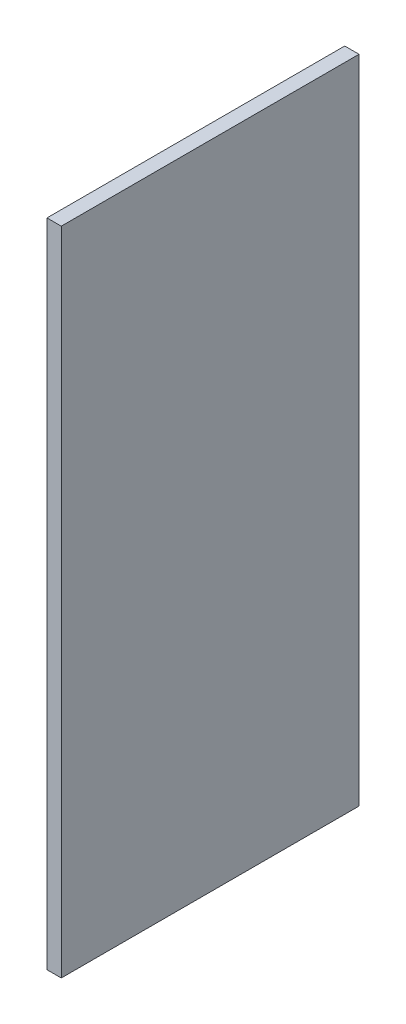
ISO-10303-21;
HEADER;
FILE_DESCRIPTION(('STEP AP214'),'2;1');
FILE_NAME('part.step','',(''),(''),'','','');
FILE_SCHEMA(('AUTOMOTIVE_DESIGN { 1 0 10303 214 1 1 1 1 }'));
ENDSEC;
DATA;
#1=APPLICATION_CONTEXT('core data for automotive mechanical design processes');
#2=APPLICATION_PROTOCOL_DEFINITION('international standard','automotive_design',2000,#1);
#3=PRODUCT_CONTEXT('',#1,'mechanical');
#4=PRODUCT('Part','Part','',(#3));
#5=PRODUCT_RELATED_PRODUCT_CATEGORY('part','',(#4));
#6=PRODUCT_DEFINITION_FORMATION('','',#4);
#7=PRODUCT_DEFINITION_CONTEXT('part definition',#1,'design');
#8=PRODUCT_DEFINITION('design','',#6,#7);
#9=PRODUCT_DEFINITION_SHAPE('','',#8);
#10=(LENGTH_UNIT() NAMED_UNIT(*) SI_UNIT(.MILLI.,.METRE.));
#11=(NAMED_UNIT(*) PLANE_ANGLE_UNIT() SI_UNIT($,.RADIAN.));
#12=(NAMED_UNIT(*) SI_UNIT($,.STERADIAN.) SOLID_ANGLE_UNIT());
#13=UNCERTAINTY_MEASURE_WITH_UNIT(LENGTH_MEASURE(1.E-05),#10,'distance_accuracy_value','');
#14=(GEOMETRIC_REPRESENTATION_CONTEXT(3) GLOBAL_UNCERTAINTY_ASSIGNED_CONTEXT((#13)) GLOBAL_UNIT_ASSIGNED_CONTEXT((#10,
#11,#12)) REPRESENTATION_CONTEXT('',''));
#15=CARTESIAN_POINT('',(0.,0.,0.));
#16=DIRECTION('',(0.,0.,1.));
#17=DIRECTION('',(1.,0.,0.));
#18=AXIS2_PLACEMENT_3D('',#15,#16,#17);
#19=CARTESIAN_POINT('',(-203.,870.,187.5));
#20=DIRECTION('',(1.,0.,0.));
#21=DIRECTION('',(0.,0.,-1.));
#22=AXIS2_PLACEMENT_3D('',#19,#20,#21);
#23=PLANE('',#22);
#24=DIRECTION('',(0.,0.,1.));
#25=VECTOR('',#24,1.);
#26=CARTESIAN_POINT('',(-203.,50.,187.5));
#27=LINE('',#26,#25);
#28=CARTESIAN_POINT('',(-203.,50.,-187.5));
#29=VERTEX_POINT('',#28);
#30=CARTESIAN_POINT('',(-203.,50.,187.5));
#31=VERTEX_POINT('',#30);
#32=EDGE_CURVE('E107',#29,#31,#27,.T.);
#33=ORIENTED_EDGE('',*,*,#32,.T.);
#34=DIRECTION('',(0.,-1.,0.));
#35=VECTOR('',#34,1.);
#36=CARTESIAN_POINT('',(-203.,870.,187.5));
#37=LINE('',#36,#35);
#38=CARTESIAN_POINT('',(-203.,870.,187.5));
#39=VERTEX_POINT('',#38);
#40=EDGE_CURVE('E11',#39,#31,#37,.T.);
#41=ORIENTED_EDGE('',*,*,#40,.F.);
#42=DIRECTION('',(0.,0.,1.));
#43=VECTOR('',#42,1.);
#44=CARTESIAN_POINT('',(-203.,870.,187.5));
#45=LINE('',#44,#43);
#46=CARTESIAN_POINT('',(-203.,870.,-187.5));
#47=VERTEX_POINT('',#46);
#48=EDGE_CURVE('E91',#47,#39,#45,.T.);
#49=ORIENTED_EDGE('',*,*,#48,.F.);
#50=DIRECTION('',(0.,-1.,0.));
#51=VECTOR('',#50,1.);
#52=CARTESIAN_POINT('',(-203.,870.,-187.5));
#53=LINE('',#52,#51);
#54=EDGE_CURVE('E103',#47,#29,#53,.T.);
#55=ORIENTED_EDGE('',*,*,#54,.T.);
#56=EDGE_LOOP('',(#33,#41,#49,#55));
#57=FACE_BOUND('',#56,.T.);
#58=ADVANCED_FACE('F39',(#57),#23,.F.);
#59=CARTESIAN_POINT('',(-203.,870.,187.5));
#60=DIRECTION('',(0.,0.,-1.));
#61=DIRECTION('',(-1.,0.,0.));
#62=AXIS2_PLACEMENT_3D('',#59,#60,#61);
#63=PLANE('',#62);
#64=DIRECTION('',(1.,0.,0.));
#65=VECTOR('',#64,1.);
#66=CARTESIAN_POINT('',(-203.,50.,187.5));
#67=LINE('',#66,#65);
#68=CARTESIAN_POINT('',(-185.,50.,187.5));
#69=VERTEX_POINT('',#68);
#70=EDGE_CURVE('E96',#31,#69,#67,.T.);
#71=ORIENTED_EDGE('',*,*,#70,.T.);
#72=DIRECTION('',(0.,-1.,0.));
#73=VECTOR('',#72,1.);
#74=CARTESIAN_POINT('',(-185.,870.,187.5));
#75=LINE('',#74,#73);
#76=CARTESIAN_POINT('',(-185.,870.,187.5));
#77=VERTEX_POINT('',#76);
#78=EDGE_CURVE('E48',#77,#69,#75,.T.);
#79=ORIENTED_EDGE('',*,*,#78,.F.);
#80=DIRECTION('',(1.,0.,0.));
#81=VECTOR('',#80,1.);
#82=CARTESIAN_POINT('',(-203.,870.,187.5));
#83=LINE('',#82,#81);
#84=EDGE_CURVE('E86',#39,#77,#83,.T.);
#85=ORIENTED_EDGE('',*,*,#84,.F.);
#86=ORIENTED_EDGE('',*,*,#40,.T.);
#87=EDGE_LOOP('',(#71,#79,#85,#86));
#88=FACE_BOUND('',#87,.T.);
#89=ADVANCED_FACE('F95',(#88),#63,.F.);
#90=CARTESIAN_POINT('',(-185.,870.,187.5));
#91=DIRECTION('',(-1.,0.,0.));
#92=DIRECTION('',(0.,0.,1.));
#93=AXIS2_PLACEMENT_3D('',#90,#91,#92);
#94=PLANE('',#93);
#95=DIRECTION('',(0.,0.,-1.));
#96=VECTOR('',#95,1.);
#97=CARTESIAN_POINT('',(-185.,50.,187.5));
#98=LINE('',#97,#96);
#99=CARTESIAN_POINT('',(-185.,50.,-187.5));
#100=VERTEX_POINT('',#99);
#101=EDGE_CURVE('E73',#69,#100,#98,.T.);
#102=ORIENTED_EDGE('',*,*,#101,.T.);
#103=DIRECTION('',(0.,-1.,0.));
#104=VECTOR('',#103,1.);
#105=CARTESIAN_POINT('',(-185.,870.,-187.5));
#106=LINE('',#105,#104);
#107=CARTESIAN_POINT('',(-185.,870.,-187.5));
#108=VERTEX_POINT('',#107);
#109=EDGE_CURVE('E98',#108,#100,#106,.T.);
#110=ORIENTED_EDGE('',*,*,#109,.F.);
#111=DIRECTION('',(0.,0.,-1.));
#112=VECTOR('',#111,1.);
#113=CARTESIAN_POINT('',(-185.,870.,187.5));
#114=LINE('',#113,#112);
#115=EDGE_CURVE('E89',#77,#108,#114,.T.);
#116=ORIENTED_EDGE('',*,*,#115,.F.);
#117=ORIENTED_EDGE('',*,*,#78,.T.);
#118=EDGE_LOOP('',(#102,#110,#116,#117));
#119=FACE_BOUND('',#118,.T.);
#120=ADVANCED_FACE('F99',(#119),#94,.F.);
#121=CARTESIAN_POINT('',(-203.,870.,-187.5));
#122=DIRECTION('',(0.,0.,1.));
#123=DIRECTION('',(1.,0.,0.));
#124=AXIS2_PLACEMENT_3D('',#121,#122,#123);
#125=PLANE('',#124);
#126=DIRECTION('',(-1.,0.,0.));
#127=VECTOR('',#126,1.);
#128=CARTESIAN_POINT('',(-203.,50.,-187.5));
#129=LINE('',#128,#127);
#130=EDGE_CURVE('E79',#100,#29,#129,.T.);
#131=ORIENTED_EDGE('',*,*,#130,.T.);
#132=ORIENTED_EDGE('',*,*,#54,.F.);
#133=DIRECTION('',(-1.,0.,0.));
#134=VECTOR('',#133,1.);
#135=CARTESIAN_POINT('',(-203.,870.,-187.5));
#136=LINE('',#135,#134);
#137=EDGE_CURVE('E56',#108,#47,#136,.T.);
#138=ORIENTED_EDGE('',*,*,#137,.F.);
#139=ORIENTED_EDGE('',*,*,#109,.T.);
#140=EDGE_LOOP('',(#131,#132,#138,#139));
#141=FACE_BOUND('',#140,.T.);
#142=ADVANCED_FACE('F120',(#141),#125,.F.);
#143=CARTESIAN_POINT('',(0.,870.,0.));
#144=DIRECTION('',(0.,-1.,0.));
#145=DIRECTION('',(0.,0.,-1.));
#146=AXIS2_PLACEMENT_3D('',#143,#144,#145);
#147=PLANE('',#146);
#148=ORIENTED_EDGE('',*,*,#48,.T.);
#149=ORIENTED_EDGE('',*,*,#84,.T.);
#150=ORIENTED_EDGE('',*,*,#115,.T.);
#151=ORIENTED_EDGE('',*,*,#137,.T.);
#152=EDGE_LOOP('',(#148,#149,#150,#151));
#153=FACE_BOUND('',#152,.T.);
#154=ADVANCED_FACE('F87',(#153),#147,.F.);
#155=CARTESIAN_POINT('',(0.,50.,0.));
#156=DIRECTION('',(0.,-1.,0.));
#157=DIRECTION('',(0.,0.,-1.));
#158=AXIS2_PLACEMENT_3D('',#155,#156,#157);
#159=PLANE('',#158);
#160=ORIENTED_EDGE('',*,*,#32,.F.);
#161=ORIENTED_EDGE('',*,*,#130,.F.);
#162=ORIENTED_EDGE('',*,*,#101,.F.);
#163=ORIENTED_EDGE('',*,*,#70,.F.);
#164=EDGE_LOOP('',(#160,#161,#162,#163));
#165=FACE_BOUND('',#164,.T.);
#166=ADVANCED_FACE('F123',(#165),#159,.T.);
#167=CLOSED_SHELL('',(#58,#89,#120,#142,#154,#166));
#168=MANIFOLD_SOLID_BREP('B2',#167);
#169=ADVANCED_BREP_SHAPE_REPRESENTATION('',(#18,#168),#14);
#170=SHAPE_DEFINITION_REPRESENTATION(#9,#169);
ENDSEC;
END-ISO-10303-21;
